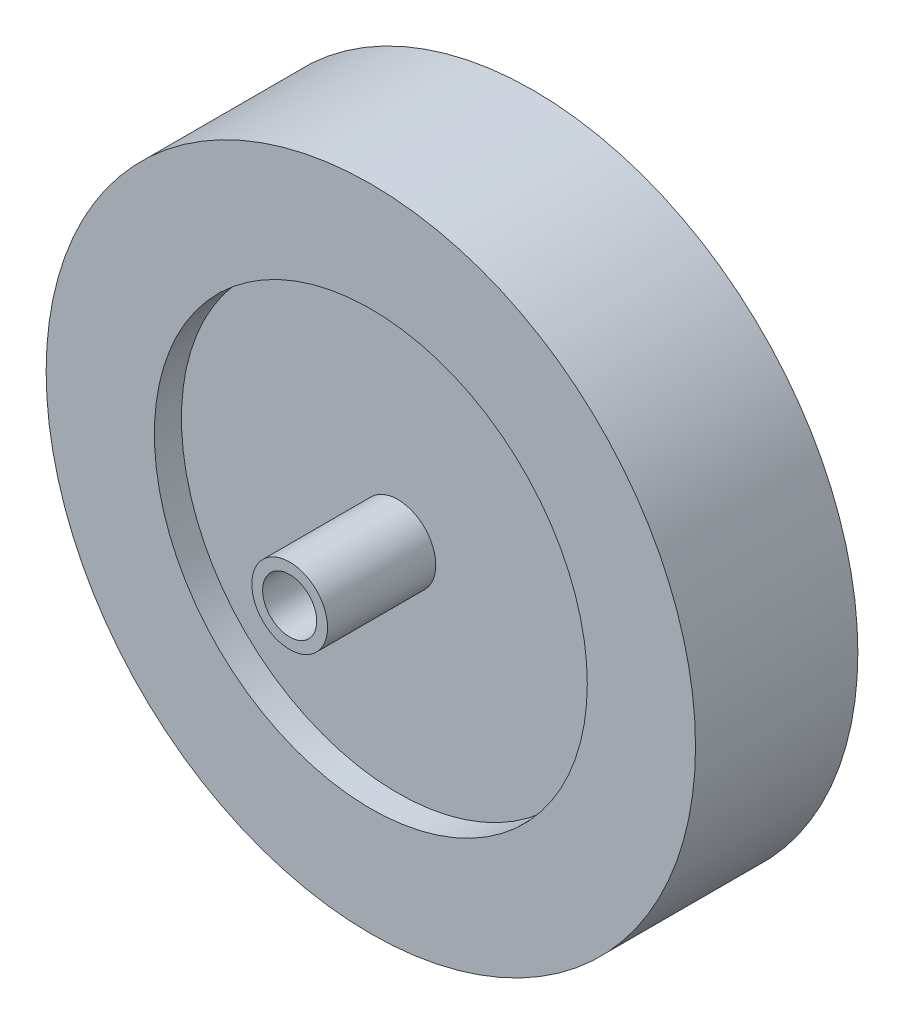
ISO-10303-21;
HEADER;
FILE_DESCRIPTION(('STEP AP214'),'2;1');
FILE_NAME('part.step','',(''),(''),'','','');
FILE_SCHEMA(('AUTOMOTIVE_DESIGN { 1 0 10303 214 1 1 1 1 }'));
ENDSEC;
DATA;
#1=APPLICATION_CONTEXT('core data for automotive mechanical design processes');
#2=APPLICATION_PROTOCOL_DEFINITION('international standard','automotive_design',2000,#1);
#3=PRODUCT_CONTEXT('',#1,'mechanical');
#4=PRODUCT('Part','Part','',(#3));
#5=PRODUCT_RELATED_PRODUCT_CATEGORY('part','',(#4));
#6=PRODUCT_DEFINITION_FORMATION('','',#4);
#7=PRODUCT_DEFINITION_CONTEXT('part definition',#1,'design');
#8=PRODUCT_DEFINITION('design','',#6,#7);
#9=PRODUCT_DEFINITION_SHAPE('','',#8);
#10=(LENGTH_UNIT() NAMED_UNIT(*) SI_UNIT(.MILLI.,.METRE.));
#11=(NAMED_UNIT(*) PLANE_ANGLE_UNIT() SI_UNIT($,.RADIAN.));
#12=(NAMED_UNIT(*) SI_UNIT($,.STERADIAN.) SOLID_ANGLE_UNIT());
#13=UNCERTAINTY_MEASURE_WITH_UNIT(LENGTH_MEASURE(1.E-05),#10,'distance_accuracy_value','');
#14=(GEOMETRIC_REPRESENTATION_CONTEXT(3) GLOBAL_UNCERTAINTY_ASSIGNED_CONTEXT((#13)) GLOBAL_UNIT_ASSIGNED_CONTEXT((#10,
#11,#12)) REPRESENTATION_CONTEXT('',''));
#15=CARTESIAN_POINT('',(0.,0.,0.));
#16=DIRECTION('',(0.,0.,1.));
#17=DIRECTION('',(1.,0.,0.));
#18=AXIS2_PLACEMENT_3D('',#15,#16,#17);
#19=CARTESIAN_POINT('',(0.,0.,30.));
#20=DIRECTION('',(0.,0.,-1.));
#21=DIRECTION('',(-1.,0.,0.));
#22=AXIS2_PLACEMENT_3D('',#19,#20,#21);
#23=CYLINDRICAL_SURFACE('',#22,5.);
#24=CARTESIAN_POINT('',(0.,0.,30.));
#25=DIRECTION('',(0.,0.,1.));
#26=DIRECTION('',(1.,0.,0.));
#27=AXIS2_PLACEMENT_3D('',#24,#25,#26);
#28=CIRCLE('',#27,5.);
#29=CARTESIAN_POINT('',(5.,0.,30.));
#30=VERTEX_POINT('',#29);
#31=EDGE_CURVE('E47',#30,#30,#28,.T.);
#32=ORIENTED_EDGE('',*,*,#31,.T.);
#33=EDGE_LOOP('',(#32));
#34=FACE_BOUND('',#33,.T.);
#35=CARTESIAN_POINT('',(0.,0.,0.));
#36=DIRECTION('',(0.,0.,1.));
#37=DIRECTION('',(1.,0.,0.));
#38=AXIS2_PLACEMENT_3D('',#35,#36,#37);
#39=CIRCLE('',#38,5.);
#40=CARTESIAN_POINT('',(5.,0.,0.));
#41=VERTEX_POINT('',#40);
#42=EDGE_CURVE('E53',#41,#41,#39,.T.);
#43=ORIENTED_EDGE('',*,*,#42,.F.);
#44=EDGE_LOOP('',(#43));
#45=FACE_BOUND('',#44,.T.);
#46=ADVANCED_FACE('F40',(#34,#45),#23,.F.);
#47=CARTESIAN_POINT('',(0.,0.,30.));
#48=DIRECTION('',(0.,0.,-1.));
#49=DIRECTION('',(-1.,0.,0.));
#50=AXIS2_PLACEMENT_3D('',#47,#48,#49);
#51=CYLINDRICAL_SURFACE('',#50,7.);
#52=CARTESIAN_POINT('',(0.,0.,30.));
#53=DIRECTION('',(0.,0.,1.));
#54=DIRECTION('',(1.,0.,0.));
#55=AXIS2_PLACEMENT_3D('',#52,#53,#54);
#56=CIRCLE('',#55,7.);
#57=CARTESIAN_POINT('',(7.,0.,30.));
#58=VERTEX_POINT('',#57);
#59=EDGE_CURVE('E11',#58,#58,#56,.T.);
#60=ORIENTED_EDGE('',*,*,#59,.F.);
#61=EDGE_LOOP('',(#60));
#62=FACE_BOUND('',#61,.T.);
#63=CARTESIAN_POINT('',(0.,0.,0.));
#64=DIRECTION('',(0.,0.,1.));
#65=DIRECTION('',(1.,0.,0.));
#66=AXIS2_PLACEMENT_3D('',#63,#64,#65);
#67=CIRCLE('',#66,7.);
#68=CARTESIAN_POINT('',(7.,0.,0.));
#69=VERTEX_POINT('',#68);
#70=EDGE_CURVE('E43',#69,#69,#67,.T.);
#71=ORIENTED_EDGE('',*,*,#70,.T.);
#72=EDGE_LOOP('',(#71));
#73=FACE_BOUND('',#72,.T.);
#74=ADVANCED_FACE('F60',(#62,#73),#51,.T.);
#75=CARTESIAN_POINT('',(0.,0.,30.));
#76=DIRECTION('',(0.,0.,1.));
#77=DIRECTION('',(1.,0.,0.));
#78=AXIS2_PLACEMENT_3D('',#75,#76,#77);
#79=PLANE('',#78);
#80=ORIENTED_EDGE('',*,*,#31,.F.);
#81=EDGE_LOOP('',(#80));
#82=FACE_BOUND('',#81,.T.);
#83=ORIENTED_EDGE('',*,*,#59,.T.);
#84=EDGE_LOOP('',(#83));
#85=FACE_BOUND('',#84,.T.);
#86=ADVANCED_FACE('F64',(#82,#85),#79,.T.);
#87=CARTESIAN_POINT('',(0.,0.,0.));
#88=DIRECTION('',(0.,0.,1.));
#89=DIRECTION('',(1.,0.,0.));
#90=AXIS2_PLACEMENT_3D('',#87,#88,#89);
#91=PLANE('',#90);
#92=ORIENTED_EDGE('',*,*,#42,.T.);
#93=EDGE_LOOP('',(#92));
#94=FACE_BOUND('',#93,.T.);
#95=ORIENTED_EDGE('',*,*,#70,.F.);
#96=EDGE_LOOP('',(#95));
#97=FACE_BOUND('',#96,.T.);
#98=ADVANCED_FACE('F62',(#94,#97),#91,.F.);
#99=CLOSED_SHELL('',(#46,#74,#86,#98));
#100=MANIFOLD_SOLID_BREP('B2',#99);
#101=CARTESIAN_POINT('',(0.,0.,-10.));
#102=DIRECTION('',(0.,0.,1.));
#103=DIRECTION('',(1.,0.,0.));
#104=AXIS2_PLACEMENT_3D('',#101,#102,#103);
#105=CYLINDRICAL_SURFACE('',#104,7.);
#106=CARTESIAN_POINT('',(0.,0.,-10.));
#107=DIRECTION('',(0.,0.,1.));
#108=DIRECTION('',(1.,0.,0.));
#109=AXIS2_PLACEMENT_3D('',#106,#107,#108);
#110=CIRCLE('',#109,7.);
#111=CARTESIAN_POINT('',(7.,0.,-10.));
#112=VERTEX_POINT('',#111);
#113=EDGE_CURVE('E115',#112,#112,#110,.T.);
#114=ORIENTED_EDGE('',*,*,#113,.F.);
#115=EDGE_LOOP('',(#114));
#116=FACE_BOUND('',#115,.T.);
#117=CARTESIAN_POINT('',(0.,0.,10.));
#118=DIRECTION('',(0.,0.,1.));
#119=DIRECTION('',(1.,0.,0.));
#120=AXIS2_PLACEMENT_3D('',#117,#118,#119);
#121=CIRCLE('',#120,7.);
#122=CARTESIAN_POINT('',(7.,0.,10.));
#123=VERTEX_POINT('',#122);
#124=EDGE_CURVE('E123',#123,#123,#121,.T.);
#125=ORIENTED_EDGE('',*,*,#124,.T.);
#126=EDGE_LOOP('',(#125));
#127=FACE_BOUND('',#126,.T.);
#128=ADVANCED_FACE('F109',(#116,#127),#105,.F.);
#129=CARTESIAN_POINT('',(0.,0.,-10.));
#130=DIRECTION('',(0.,0.,1.));
#131=DIRECTION('',(1.,0.,0.));
#132=AXIS2_PLACEMENT_3D('',#129,#130,#131);
#133=CYLINDRICAL_SURFACE('',#132,40.);
#134=CARTESIAN_POINT('',(0.,0.,-10.));
#135=DIRECTION('',(0.,0.,1.));
#136=DIRECTION('',(1.,0.,0.));
#137=AXIS2_PLACEMENT_3D('',#134,#135,#136);
#138=CIRCLE('',#137,40.);
#139=CARTESIAN_POINT('',(40.,0.,-10.));
#140=VERTEX_POINT('',#139);
#141=EDGE_CURVE('E39',#140,#140,#138,.T.);
#142=ORIENTED_EDGE('',*,*,#141,.T.);
#143=EDGE_LOOP('',(#142));
#144=FACE_BOUND('',#143,.T.);
#145=CARTESIAN_POINT('',(0.,0.,10.));
#146=DIRECTION('',(0.,0.,1.));
#147=DIRECTION('',(1.,0.,0.));
#148=AXIS2_PLACEMENT_3D('',#145,#146,#147);
#149=CIRCLE('',#148,40.);
#150=CARTESIAN_POINT('',(40.,0.,10.));
#151=VERTEX_POINT('',#150);
#152=EDGE_CURVE('E119',#151,#151,#149,.T.);
#153=ORIENTED_EDGE('',*,*,#152,.F.);
#154=EDGE_LOOP('',(#153));
#155=FACE_BOUND('',#154,.T.);
#156=ADVANCED_FACE('F137',(#144,#155),#133,.T.);
#157=CARTESIAN_POINT('',(0.,0.,-10.));
#158=DIRECTION('',(0.,0.,1.));
#159=DIRECTION('',(1.,0.,0.));
#160=AXIS2_PLACEMENT_3D('',#157,#158,#159);
#161=PLANE('',#160);
#162=ORIENTED_EDGE('',*,*,#113,.T.);
#163=EDGE_LOOP('',(#162));
#164=FACE_BOUND('',#163,.T.);
#165=ORIENTED_EDGE('',*,*,#141,.F.);
#166=EDGE_LOOP('',(#165));
#167=FACE_BOUND('',#166,.T.);
#168=ADVANCED_FACE('F133',(#164,#167),#161,.F.);
#169=CARTESIAN_POINT('',(0.,0.,10.));
#170=DIRECTION('',(0.,0.,1.));
#171=DIRECTION('',(1.,0.,0.));
#172=AXIS2_PLACEMENT_3D('',#169,#170,#171);
#173=PLANE('',#172);
#174=ORIENTED_EDGE('',*,*,#124,.F.);
#175=EDGE_LOOP('',(#174));
#176=FACE_BOUND('',#175,.T.);
#177=ORIENTED_EDGE('',*,*,#152,.T.);
#178=EDGE_LOOP('',(#177));
#179=FACE_BOUND('',#178,.T.);
#180=ADVANCED_FACE('F130',(#176,#179),#173,.T.);
#181=CLOSED_SHELL('',(#128,#156,#168,#180));
#182=MANIFOLD_SOLID_BREP('B6',#181);
#183=CARTESIAN_POINT('',(0.,0.,-15.));
#184=DIRECTION('',(0.,0.,1.));
#185=DIRECTION('',(1.,0.,0.));
#186=AXIS2_PLACEMENT_3D('',#183,#184,#185);
#187=CYLINDRICAL_SURFACE('',#186,40.);
#188=CARTESIAN_POINT('',(0.,0.,-15.));
#189=DIRECTION('',(0.,0.,1.));
#190=DIRECTION('',(1.,0.,0.));
#191=AXIS2_PLACEMENT_3D('',#188,#189,#190);
#192=CIRCLE('',#191,40.);
#193=CARTESIAN_POINT('',(40.,0.,-15.));
#194=VERTEX_POINT('',#193);
#195=EDGE_CURVE('E177',#194,#194,#192,.T.);
#196=ORIENTED_EDGE('',*,*,#195,.F.);
#197=EDGE_LOOP('',(#196));
#198=FACE_BOUND('',#197,.T.);
#199=CARTESIAN_POINT('',(0.,0.,15.));
#200=DIRECTION('',(0.,0.,1.));
#201=DIRECTION('',(1.,0.,0.));
#202=AXIS2_PLACEMENT_3D('',#199,#200,#201);
#203=CIRCLE('',#202,40.);
#204=CARTESIAN_POINT('',(40.,0.,15.));
#205=VERTEX_POINT('',#204);
#206=EDGE_CURVE('E185',#205,#205,#203,.T.);
#207=ORIENTED_EDGE('',*,*,#206,.T.);
#208=EDGE_LOOP('',(#207));
#209=FACE_BOUND('',#208,.T.);
#210=ADVANCED_FACE('F171',(#198,#209),#187,.F.);
#211=CARTESIAN_POINT('',(0.,0.,-15.));
#212=DIRECTION('',(0.,0.,1.));
#213=DIRECTION('',(1.,0.,0.));
#214=AXIS2_PLACEMENT_3D('',#211,#212,#213);
#215=CYLINDRICAL_SURFACE('',#214,60.);
#216=CARTESIAN_POINT('',(0.,0.,-15.));
#217=DIRECTION('',(0.,0.,1.));
#218=DIRECTION('',(1.,0.,0.));
#219=AXIS2_PLACEMENT_3D('',#216,#217,#218);
#220=CIRCLE('',#219,60.);
#221=CARTESIAN_POINT('',(60.,0.,-15.));
#222=VERTEX_POINT('',#221);
#223=EDGE_CURVE('E108',#222,#222,#220,.T.);
#224=ORIENTED_EDGE('',*,*,#223,.T.);
#225=EDGE_LOOP('',(#224));
#226=FACE_BOUND('',#225,.T.);
#227=CARTESIAN_POINT('',(0.,0.,15.));
#228=DIRECTION('',(0.,0.,1.));
#229=DIRECTION('',(1.,0.,0.));
#230=AXIS2_PLACEMENT_3D('',#227,#228,#229);
#231=CIRCLE('',#230,60.);
#232=CARTESIAN_POINT('',(60.,0.,15.));
#233=VERTEX_POINT('',#232);
#234=EDGE_CURVE('E181',#233,#233,#231,.T.);
#235=ORIENTED_EDGE('',*,*,#234,.F.);
#236=EDGE_LOOP('',(#235));
#237=FACE_BOUND('',#236,.T.);
#238=ADVANCED_FACE('F199',(#226,#237),#215,.T.);
#239=CARTESIAN_POINT('',(0.,0.,-15.));
#240=DIRECTION('',(0.,0.,1.));
#241=DIRECTION('',(1.,0.,0.));
#242=AXIS2_PLACEMENT_3D('',#239,#240,#241);
#243=PLANE('',#242);
#244=ORIENTED_EDGE('',*,*,#195,.T.);
#245=EDGE_LOOP('',(#244));
#246=FACE_BOUND('',#245,.T.);
#247=ORIENTED_EDGE('',*,*,#223,.F.);
#248=EDGE_LOOP('',(#247));
#249=FACE_BOUND('',#248,.T.);
#250=ADVANCED_FACE('F195',(#246,#249),#243,.F.);
#251=CARTESIAN_POINT('',(0.,0.,15.));
#252=DIRECTION('',(0.,0.,1.));
#253=DIRECTION('',(1.,0.,0.));
#254=AXIS2_PLACEMENT_3D('',#251,#252,#253);
#255=PLANE('',#254);
#256=ORIENTED_EDGE('',*,*,#206,.F.);
#257=EDGE_LOOP('',(#256));
#258=FACE_BOUND('',#257,.T.);
#259=ORIENTED_EDGE('',*,*,#234,.T.);
#260=EDGE_LOOP('',(#259));
#261=FACE_BOUND('',#260,.T.);
#262=ADVANCED_FACE('F192',(#258,#261),#255,.T.);
#263=CLOSED_SHELL('',(#210,#238,#250,#262));
#264=MANIFOLD_SOLID_BREP('B34',#263);
#265=ADVANCED_BREP_SHAPE_REPRESENTATION('',(#18,#100,#182,#264),#14);
#266=SHAPE_DEFINITION_REPRESENTATION(#9,#265);
ENDSEC;
END-ISO-10303-21;
